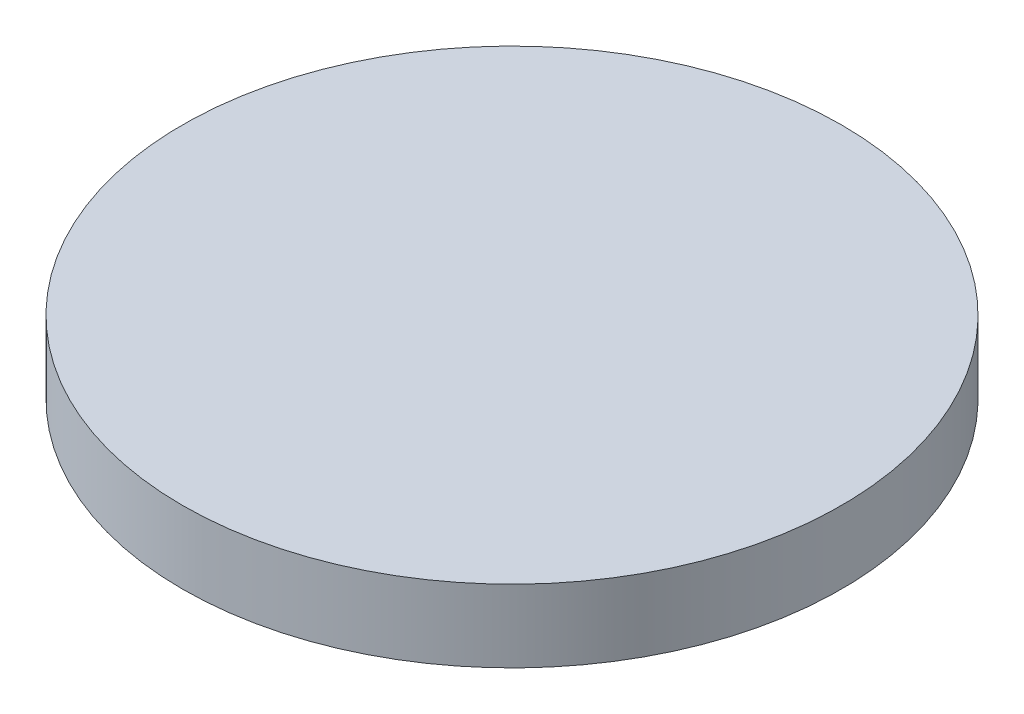
ISO-10303-21;
HEADER;
FILE_DESCRIPTION(('STEP AP214'),'2;1');
FILE_NAME('part.step','',(''),(''),'','','');
FILE_SCHEMA(('AUTOMOTIVE_DESIGN { 1 0 10303 214 1 1 1 1 }'));
ENDSEC;
DATA;
#1=APPLICATION_CONTEXT('core data for automotive mechanical design processes');
#2=APPLICATION_PROTOCOL_DEFINITION('international standard','automotive_design',2000,#1);
#3=PRODUCT_CONTEXT('',#1,'mechanical');
#4=PRODUCT('Part','Part','',(#3));
#5=PRODUCT_RELATED_PRODUCT_CATEGORY('part','',(#4));
#6=PRODUCT_DEFINITION_FORMATION('','',#4);
#7=PRODUCT_DEFINITION_CONTEXT('part definition',#1,'design');
#8=PRODUCT_DEFINITION('design','',#6,#7);
#9=PRODUCT_DEFINITION_SHAPE('','',#8);
#10=(LENGTH_UNIT() NAMED_UNIT(*) SI_UNIT(.MILLI.,.METRE.));
#11=(NAMED_UNIT(*) PLANE_ANGLE_UNIT() SI_UNIT($,.RADIAN.));
#12=(NAMED_UNIT(*) SI_UNIT($,.STERADIAN.) SOLID_ANGLE_UNIT());
#13=UNCERTAINTY_MEASURE_WITH_UNIT(LENGTH_MEASURE(1.E-05),#10,'distance_accuracy_value','');
#14=(GEOMETRIC_REPRESENTATION_CONTEXT(3) GLOBAL_UNCERTAINTY_ASSIGNED_CONTEXT((#13)) GLOBAL_UNIT_ASSIGNED_CONTEXT((#10,
#11,#12)) REPRESENTATION_CONTEXT('',''));
#15=CARTESIAN_POINT('',(0.,0.,0.));
#16=DIRECTION('',(0.,0.,1.));
#17=DIRECTION('',(1.,0.,0.));
#18=AXIS2_PLACEMENT_3D('',#15,#16,#17);
#19=CARTESIAN_POINT('',(0.,4.4,0.));
#20=DIRECTION('',(0.,-1.,0.));
#21=DIRECTION('',(0.,0.,-1.));
#22=AXIS2_PLACEMENT_3D('',#19,#20,#21);
#23=CYLINDRICAL_SURFACE('',#22,20.);
#24=CARTESIAN_POINT('',(0.,4.4,0.));
#25=DIRECTION('',(0.,1.,0.));
#26=DIRECTION('',(0.,0.,1.));
#27=AXIS2_PLACEMENT_3D('',#24,#25,#26);
#28=CIRCLE('',#27,20.);
#29=CARTESIAN_POINT('',(0.,4.4,20.));
#30=VERTEX_POINT('',#29);
#31=EDGE_CURVE('E10',#30,#30,#28,.T.);
#32=ORIENTED_EDGE('',*,*,#31,.F.);
#33=EDGE_LOOP('',(#32));
#34=FACE_BOUND('',#33,.T.);
#35=CARTESIAN_POINT('',(0.,0.,0.));
#36=DIRECTION('',(0.,1.,0.));
#37=DIRECTION('',(0.,0.,1.));
#38=AXIS2_PLACEMENT_3D('',#35,#36,#37);
#39=CIRCLE('',#38,20.);
#40=CARTESIAN_POINT('',(0.,0.,20.));
#41=VERTEX_POINT('',#40);
#42=EDGE_CURVE('E36',#41,#41,#39,.T.);
#43=ORIENTED_EDGE('',*,*,#42,.T.);
#44=EDGE_LOOP('',(#43));
#45=FACE_BOUND('',#44,.T.);
#46=ADVANCED_FACE('F33',(#34,#45),#23,.T.);
#47=CARTESIAN_POINT('',(0.,4.4,0.));
#48=DIRECTION('',(0.,1.,0.));
#49=DIRECTION('',(0.,0.,1.));
#50=AXIS2_PLACEMENT_3D('',#47,#48,#49);
#51=PLANE('',#50);
#52=ORIENTED_EDGE('',*,*,#31,.T.);
#53=EDGE_LOOP('',(#52));
#54=FACE_BOUND('',#53,.T.);
#55=ADVANCED_FACE('F48',(#54),#51,.T.);
#56=CARTESIAN_POINT('',(0.,0.,0.));
#57=DIRECTION('',(0.,1.,0.));
#58=DIRECTION('',(0.,0.,1.));
#59=AXIS2_PLACEMENT_3D('',#56,#57,#58);
#60=PLANE('',#59);
#61=ORIENTED_EDGE('',*,*,#42,.F.);
#62=EDGE_LOOP('',(#61));
#63=FACE_BOUND('',#62,.T.);
#64=ADVANCED_FACE('F46',(#63),#60,.F.);
#65=CLOSED_SHELL('',(#46,#55,#64));
#66=MANIFOLD_SOLID_BREP('B2',#65);
#67=ADVANCED_BREP_SHAPE_REPRESENTATION('',(#18,#66),#14);
#68=SHAPE_DEFINITION_REPRESENTATION(#9,#67);
ENDSEC;
END-ISO-10303-21;
